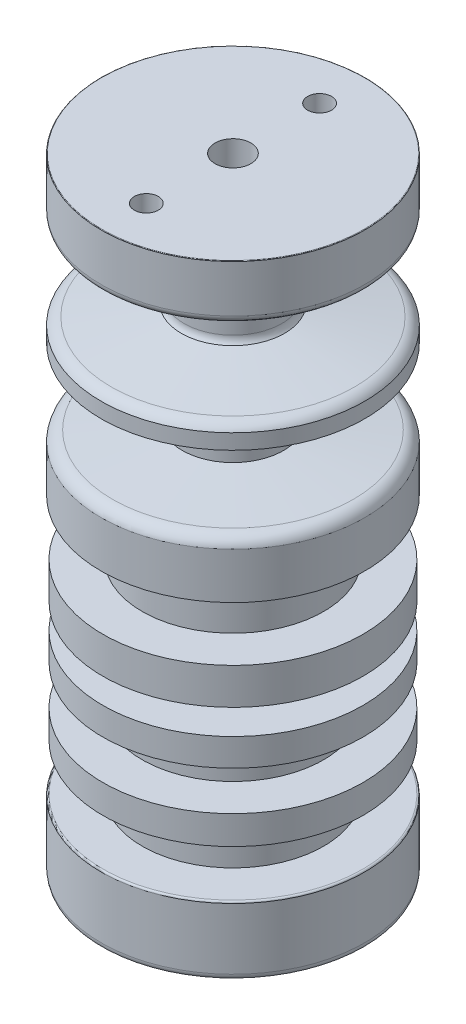
ISO-10303-21;
HEADER;
FILE_DESCRIPTION(('STEP AP214'),'2;1');
FILE_NAME('part.step','',(''),(''),'','','');
FILE_SCHEMA(('AUTOMOTIVE_DESIGN { 1 0 10303 214 1 1 1 1 }'));
ENDSEC;
DATA;
#1=APPLICATION_CONTEXT('core data for automotive mechanical design processes');
#2=APPLICATION_PROTOCOL_DEFINITION('international standard','automotive_design',2000,#1);
#3=PRODUCT_CONTEXT('',#1,'mechanical');
#4=PRODUCT('Part','Part','',(#3));
#5=PRODUCT_RELATED_PRODUCT_CATEGORY('part','',(#4));
#6=PRODUCT_DEFINITION_FORMATION('','',#4);
#7=PRODUCT_DEFINITION_CONTEXT('part definition',#1,'design');
#8=PRODUCT_DEFINITION('design','',#6,#7);
#9=PRODUCT_DEFINITION_SHAPE('','',#8);
#10=(LENGTH_UNIT() NAMED_UNIT(*) SI_UNIT(.MILLI.,.METRE.));
#11=(NAMED_UNIT(*) PLANE_ANGLE_UNIT() SI_UNIT($,.RADIAN.));
#12=(NAMED_UNIT(*) SI_UNIT($,.STERADIAN.) SOLID_ANGLE_UNIT());
#13=UNCERTAINTY_MEASURE_WITH_UNIT(LENGTH_MEASURE(1.E-05),#10,'distance_accuracy_value','');
#14=(GEOMETRIC_REPRESENTATION_CONTEXT(3) GLOBAL_UNCERTAINTY_ASSIGNED_CONTEXT((#13)) GLOBAL_UNIT_ASSIGNED_CONTEXT((#10,
#11,#12)) REPRESENTATION_CONTEXT('',''));
#15=CARTESIAN_POINT('',(0.,0.,0.));
#16=DIRECTION('',(0.,0.,1.));
#17=DIRECTION('',(1.,0.,0.));
#18=AXIS2_PLACEMENT_3D('',#15,#16,#17);
#19=CARTESIAN_POINT('',(0.,-121.955431754864,0.));
#20=DIRECTION('',(0.,-1.,0.));
#21=DIRECTION('',(1.,0.,0.));
#22=AXIS2_PLACEMENT_3D('',#19,#20,#21);
#23=CONICAL_SURFACE('',#22,0.,1.56977202903622);
#24=CARTESIAN_POINT('',(0.,-121.991013624139,0.));
#25=DIRECTION('',(0.,1.,0.));
#26=DIRECTION('',(-1.,0.,0.));
#27=AXIS2_PLACEMENT_3D('',#24,#25,#26);
#28=CIRCLE('',#27,34.7378060037741);
#29=CARTESIAN_POINT('',(34.7378060037709,-121.991013624139,0.));
#30=VERTEX_POINT('',#29);
#31=EDGE_CURVE('E135',#30,#30,#28,.T.);
#32=CARTESIAN_POINT('',(0.,-121.963562121167,0.));
#33=DIRECTION('',(0.,-1.,0.));
#34=DIRECTION('',(1.,0.,0.));
#35=AXIS2_PLACEMENT_3D('',#32,#33,#34);
#36=CIRCLE('',#35,7.9375);
#37=CARTESIAN_POINT('',(7.93749999999986,-121.963562121167,0.));
#38=VERTEX_POINT('',#37);
#39=EDGE_CURVE('E35',#38,#38,#36,.T.);
#40=CARTESIAN_POINT('',(34.7378060037709,-121.991013624139,0.));
#41=CARTESIAN_POINT('',(34.4586361495649,-121.990727670983,0.));
#42=CARTESIAN_POINT('',(34.179466295359,-121.990441717827,0.));
#43=CARTESIAN_POINT('',(33.6211265869471,-121.989869811515,0.));
#44=CARTESIAN_POINT('',(33.3419567327411,-121.989583858359,0.));
#45=CARTESIAN_POINT('',(32.7836170243292,-121.989011952047,0.));
#46=CARTESIAN_POINT('',(32.5044471701233,-121.988725998891,0.));
#47=CARTESIAN_POINT('',(31.9461074617114,-121.988154092579,0.));
#48=CARTESIAN_POINT('',(31.6669376075054,-121.987868139423,0.));
#49=CARTESIAN_POINT('',(31.1085978990935,-121.987296233111,0.));
#50=CARTESIAN_POINT('',(30.8294280448876,-121.987010279955,0.));
#51=CARTESIAN_POINT('',(30.2710883364757,-121.986438373643,0.));
#52=CARTESIAN_POINT('',(29.9919184822697,-121.986152420487,0.));
#53=CARTESIAN_POINT('',(29.4335787738579,-121.985580514175,0.));
#54=CARTESIAN_POINT('',(29.1544089196519,-121.985294561019,0.));
#55=CARTESIAN_POINT('',(28.59606921124,-121.984722654708,0.));
#56=CARTESIAN_POINT('',(28.3168993570341,-121.984436701552,0.));
#57=CARTESIAN_POINT('',(27.7585596486222,-121.98386479524,0.));
#58=CARTESIAN_POINT('',(27.4793897944162,-121.983578842084,0.));
#59=CARTESIAN_POINT('',(26.9210500860043,-121.983006935772,0.));
#60=CARTESIAN_POINT('',(26.6418802317984,-121.982720982616,0.));
#61=CARTESIAN_POINT('',(26.0835405233865,-121.982149076304,0.));
#62=CARTESIAN_POINT('',(25.8043706691805,-121.981863123148,0.));
#63=CARTESIAN_POINT('',(25.2460309607686,-121.981291216836,0.));
#64=CARTESIAN_POINT('',(24.9668611065627,-121.98100526368,0.));
#65=CARTESIAN_POINT('',(24.4085213981508,-121.980433357368,0.));
#66=CARTESIAN_POINT('',(24.1293515439448,-121.980147404212,0.));
#67=CARTESIAN_POINT('',(23.5710118355329,-121.9795754979,0.));
#68=CARTESIAN_POINT('',(23.291841981327,-121.979289544744,0.));
#69=CARTESIAN_POINT('',(22.7335022729151,-121.978717638432,0.));
#70=CARTESIAN_POINT('',(22.4543324187092,-121.978431685276,0.));
#71=CARTESIAN_POINT('',(21.8959927102973,-121.977859778965,0.));
#72=CARTESIAN_POINT('',(21.6168228560913,-121.977573825809,0.));
#73=CARTESIAN_POINT('',(21.0584831476794,-121.977001919497,0.));
#74=CARTESIAN_POINT('',(20.7793132934735,-121.976715966341,0.));
#75=CARTESIAN_POINT('',(20.2209735850616,-121.976144060029,0.));
#76=CARTESIAN_POINT('',(19.9418037308556,-121.975858106873,0.));
#77=CARTESIAN_POINT('',(19.3834640224437,-121.975286200561,0.));
#78=CARTESIAN_POINT('',(19.1042941682378,-121.975000247405,0.));
#79=CARTESIAN_POINT('',(18.5459544598259,-121.974428341093,0.));
#80=CARTESIAN_POINT('',(18.2667846056199,-121.974142387937,0.));
#81=CARTESIAN_POINT('',(17.708444897208,-121.973570481625,0.));
#82=CARTESIAN_POINT('',(17.4292750430021,-121.973284528469,0.));
#83=CARTESIAN_POINT('',(16.8709353345902,-121.972712622157,0.));
#84=CARTESIAN_POINT('',(16.5917654803842,-121.972426669001,0.));
#85=CARTESIAN_POINT('',(16.0334257719724,-121.971854762689,0.));
#86=CARTESIAN_POINT('',(15.7542559177664,-121.971568809533,0.));
#87=CARTESIAN_POINT('',(15.1959162093545,-121.970996903221,0.));
#88=CARTESIAN_POINT('',(14.9167463551486,-121.970710950066,0.));
#89=CARTESIAN_POINT('',(14.3584066467367,-121.970139043754,0.));
#90=CARTESIAN_POINT('',(14.0792367925307,-121.969853090598,0.));
#91=CARTESIAN_POINT('',(13.5208970841188,-121.969281184286,0.));
#92=CARTESIAN_POINT('',(13.2417272299129,-121.96899523113,0.));
#93=CARTESIAN_POINT('',(12.683387521501,-121.968423324818,0.));
#94=CARTESIAN_POINT('',(12.404217667295,-121.968137371662,0.));
#95=CARTESIAN_POINT('',(11.8458779588831,-121.96756546535,0.));
#96=CARTESIAN_POINT('',(11.5667081046772,-121.967279512194,0.));
#97=CARTESIAN_POINT('',(11.0083683962653,-121.966707605882,0.));
#98=CARTESIAN_POINT('',(10.7291985420593,-121.966421652726,0.));
#99=CARTESIAN_POINT('',(10.1708588336474,-121.965849746414,0.));
#100=CARTESIAN_POINT('',(9.8916889794415,-121.965563793258,0.));
#101=CARTESIAN_POINT('',(9.3333492710296,-121.964991886946,0.));
#102=CARTESIAN_POINT('',(9.05417941682365,-121.96470593379,0.));
#103=CARTESIAN_POINT('',(8.49583970841176,-121.964134027478,0.));
#104=CARTESIAN_POINT('',(8.21666985420581,-121.963848074323,0.));
#105=CARTESIAN_POINT('',(7.93749999999986,-121.963562121167,0.));
#106=B_SPLINE_CURVE_WITH_KNOTS('',3,(#40,#41,#42,#43,#44,#45,#46,#47,#48,#49,#50,#51,#52,#53,
#54,#55,#56,#57,#58,#59,#60,#61,#62,#63,#64,#65,#66,#67,#68,#69,#70,#71,#72,#73,#74,#75,#76,#77,
#78,#79,#80,#81,#82,#83,#84,#85,#86,#87,#88,#89,#90,#91,#92,#93,#94,#95,#96,#97,#98,#99,#100,
#101,#102,#103,#104,#105),.UNSPECIFIED.,.F.,.F.,(4,2,2,2,2,2,2,2,2,2,2,2,2,2,2,2,2,2,2,2,2,2,2,
2,2,2,2,2,2,2,2,2,4),(0.,0.837510001969652,1.6750200039393,2.51253000590894,3.35004000787859,
4.18755000984824,5.02506001181789,5.86257001378753,6.70008001575718,7.53759001772683,
8.37510001969648,9.21261002166612,10.0501200236358,10.8876300256054,11.7251400275751,
12.5626500295447,13.4001600315144,14.237670033484,15.0751800354537,15.9126900374233,
16.7502000393929,17.5877100413626,18.4252200433322,19.2627300453019,20.1002400472715,
20.9377500492412,21.7752600512108,22.6127700531805,23.4502800551501,24.2877900571198,
25.1253000590894,25.9628100610591,26.8003200630287),.UNSPECIFIED.);
#107=EDGE_CURVE('BSEAM31',#30,#38,#106,.T.);
#108=ORIENTED_EDGE('',*,*,#31,.F.);
#109=ORIENTED_EDGE('',*,*,#39,.F.);
#110=ORIENTED_EDGE('',*,*,#107,.T.);
#111=ORIENTED_EDGE('',*,*,#107,.F.);
#112=EDGE_LOOP('',(#108,#110,#109,#111));
#113=FACE_BOUND('',#112,.T.);
#114=ADVANCED_FACE('F31',(#113),#23,.F.);
#115=CARTESIAN_POINT('',(0.,43.0445682451364,0.));
#116=DIRECTION('',(0.,-1.,0.));
#117=DIRECTION('',(1.,0.,0.));
#118=AXIS2_PLACEMENT_3D('',#115,#116,#117);
#119=PLANE('',#118);
#120=CARTESIAN_POINT('',(0.,43.0445682451364,0.));
#121=DIRECTION('',(0.,1.,0.));
#122=DIRECTION('',(0.,0.,1.));
#123=AXIS2_PLACEMENT_3D('',#120,#121,#122);
#124=CIRCLE('',#123,4.7625);
#125=CARTESIAN_POINT('',(0.,43.0445682451364,4.7625));
#126=VERTEX_POINT('',#125);
#127=EDGE_CURVE('E151',#126,#126,#124,.T.);
#128=ORIENTED_EDGE('',*,*,#127,.F.);
#129=EDGE_LOOP('',(#128));
#130=FACE_BOUND('',#129,.T.);
#131=CARTESIAN_POINT('',(0.,43.0445682451364,23.));
#132=DIRECTION('',(0.,1.,0.));
#133=DIRECTION('',(0.,0.,1.));
#134=AXIS2_PLACEMENT_3D('',#131,#132,#133);
#135=CIRCLE('',#134,3.175);
#136=CARTESIAN_POINT('',(0.,43.0445682451364,26.175));
#137=VERTEX_POINT('',#136);
#138=EDGE_CURVE('E145',#137,#137,#135,.T.);
#139=ORIENTED_EDGE('',*,*,#138,.F.);
#140=EDGE_LOOP('',(#139));
#141=FACE_BOUND('',#140,.T.);
#142=CARTESIAN_POINT('',(0.,43.0445682451364,-23.));
#143=DIRECTION('',(0.,1.,0.));
#144=DIRECTION('',(0.,0.,1.));
#145=AXIS2_PLACEMENT_3D('',#142,#143,#144);
#146=CIRCLE('',#145,3.175);
#147=CARTESIAN_POINT('',(0.,43.0445682451364,-19.825));
#148=VERTEX_POINT('',#147);
#149=EDGE_CURVE('E139',#148,#148,#146,.T.);
#150=ORIENTED_EDGE('',*,*,#149,.F.);
#151=EDGE_LOOP('',(#150));
#152=FACE_BOUND('',#151,.T.);
#153=CARTESIAN_POINT('',(0.,43.0445682451364,0.));
#154=DIRECTION('',(0.,1.,0.));
#155=DIRECTION('',(-1.,0.,0.));
#156=AXIS2_PLACEMENT_3D('',#153,#154,#155);
#157=CIRCLE('',#156,34.8584196821975);
#158=CARTESIAN_POINT('',(-34.8584196821975,43.0445682451364,0.));
#159=VERTEX_POINT('',#158);
#160=EDGE_CURVE('E10',#159,#159,#157,.T.);
#161=ORIENTED_EDGE('',*,*,#160,.T.);
#162=EDGE_LOOP('',(#161));
#163=FACE_BOUND('',#162,.T.);
#164=ADVANCED_FACE('F33',(#130,#141,#152,#163),#119,.F.);
#165=CARTESIAN_POINT('',(0.,42.9029879273339,0.));
#166=DIRECTION('',(0.,1.,0.));
#167=DIRECTION('',(-1.,0.,0.));
#168=AXIS2_PLACEMENT_3D('',#165,#166,#167);
#169=TOROIDAL_SURFACE('',#168,34.8584196821975,0.141580317802481);
#170=ORIENTED_EDGE('',*,*,#160,.F.);
#171=EDGE_LOOP('',(#170));
#172=FACE_BOUND('',#171,.T.);
#173=CARTESIAN_POINT('',(0.,42.9029879273339,0.));
#174=DIRECTION('',(0.,1.,0.));
#175=DIRECTION('',(-1.,0.,0.));
#176=AXIS2_PLACEMENT_3D('',#173,#174,#175);
#177=CIRCLE('',#176,35.);
#178=CARTESIAN_POINT('',(-35.,42.9029879273339,0.));
#179=VERTEX_POINT('',#178);
#180=EDGE_CURVE('E39',#179,#179,#177,.T.);
#181=ORIENTED_EDGE('',*,*,#180,.T.);
#182=EDGE_LOOP('',(#181));
#183=FACE_BOUND('',#182,.T.);
#184=ADVANCED_FACE('F171',(#172,#183),#169,.T.);
#185=CARTESIAN_POINT('',(0.,43.0445682451364,0.));
#186=DIRECTION('',(0.,1.,0.));
#187=DIRECTION('',(-1.,0.,0.));
#188=AXIS2_PLACEMENT_3D('',#185,#186,#187);
#189=CYLINDRICAL_SURFACE('',#188,35.);
#190=ORIENTED_EDGE('',*,*,#180,.F.);
#191=EDGE_LOOP('',(#190));
#192=FACE_BOUND('',#191,.T.);
#193=CARTESIAN_POINT('',(0.,30.3660149299546,0.));
#194=DIRECTION('',(0.,1.,0.));
#195=DIRECTION('',(-1.,0.,0.));
#196=AXIS2_PLACEMENT_3D('',#193,#194,#195);
#197=CIRCLE('',#196,35.);
#198=CARTESIAN_POINT('',(-35.,30.3660149299546,0.));
#199=VERTEX_POINT('',#198);
#200=EDGE_CURVE('E43',#199,#199,#197,.T.);
#201=ORIENTED_EDGE('',*,*,#200,.T.);
#202=EDGE_LOOP('',(#201));
#203=FACE_BOUND('',#202,.T.);
#204=ADVANCED_FACE('F297',(#192,#203),#189,.T.);
#205=CARTESIAN_POINT('',(0.,30.3660149299546,0.));
#206=DIRECTION('',(0.,1.,0.));
#207=DIRECTION('',(-1.,0.,0.));
#208=AXIS2_PLACEMENT_3D('',#205,#206,#207);
#209=TOROIDAL_SURFACE('',#208,32.9643531045201,2.03564689547988);
#210=ORIENTED_EDGE('',*,*,#200,.F.);
#211=EDGE_LOOP('',(#210));
#212=FACE_BOUND('',#211,.T.);
#213=CARTESIAN_POINT('',(0.,28.3303680344748,0.));
#214=DIRECTION('',(0.,1.,0.));
#215=DIRECTION('',(-1.,0.,0.));
#216=AXIS2_PLACEMENT_3D('',#213,#214,#215);
#217=CIRCLE('',#216,32.9643531045201);
#218=CARTESIAN_POINT('',(-32.9643531045201,28.3303680344747,0.));
#219=VERTEX_POINT('',#218);
#220=EDGE_CURVE('E48',#219,#219,#217,.T.);
#221=ORIENTED_EDGE('',*,*,#220,.T.);
#222=EDGE_LOOP('',(#221));
#223=FACE_BOUND('',#222,.T.);
#224=ADVANCED_FACE('F293',(#212,#223),#209,.T.);
#225=CARTESIAN_POINT('',(32.9643531045201,28.3303680344748,0.));
#226=DIRECTION('',(0.,1.,0.));
#227=DIRECTION('',(-1.,0.,0.));
#228=AXIS2_PLACEMENT_3D('',#225,#226,#227);
#229=PLANE('',#228);
#230=ORIENTED_EDGE('',*,*,#220,.F.);
#231=EDGE_LOOP('',(#230));
#232=FACE_BOUND('',#231,.T.);
#233=CARTESIAN_POINT('',(0.,28.3303680344748,0.));
#234=DIRECTION('',(0.,1.,0.));
#235=DIRECTION('',(-1.,0.,0.));
#236=AXIS2_PLACEMENT_3D('',#233,#234,#235);
#237=CIRCLE('',#236,12.9857969124329);
#238=CARTESIAN_POINT('',(-12.9857969124329,28.3303680344748,0.));
#239=VERTEX_POINT('',#238);
#240=EDGE_CURVE('E51',#239,#239,#237,.T.);
#241=ORIENTED_EDGE('',*,*,#240,.T.);
#242=EDGE_LOOP('',(#241));
#243=FACE_BOUND('',#242,.T.);
#244=ADVANCED_FACE('F289',(#232,#243),#229,.F.);
#245=CARTESIAN_POINT('',(0.,43.0445682451364,0.));
#246=DIRECTION('',(0.,1.,0.));
#247=DIRECTION('',(-1.,0.,0.));
#248=AXIS2_PLACEMENT_3D('',#245,#246,#247);
#249=CYLINDRICAL_SURFACE('',#248,12.9857969124329);
#250=ORIENTED_EDGE('',*,*,#240,.F.);
#251=EDGE_LOOP('',(#250));
#252=FACE_BOUND('',#251,.T.);
#253=CARTESIAN_POINT('',(0.,10.4062076007876,0.));
#254=DIRECTION('',(0.,1.,0.));
#255=DIRECTION('',(-1.,0.,0.));
#256=AXIS2_PLACEMENT_3D('',#253,#254,#255);
#257=CIRCLE('',#256,12.9857969124329);
#258=CARTESIAN_POINT('',(-12.9857969124329,10.4062076007876,0.));
#259=VERTEX_POINT('',#258);
#260=EDGE_CURVE('E54',#259,#259,#257,.T.);
#261=ORIENTED_EDGE('',*,*,#260,.T.);
#262=EDGE_LOOP('',(#261));
#263=FACE_BOUND('',#262,.T.);
#264=ADVANCED_FACE('F285',(#252,#263),#249,.T.);
#265=CARTESIAN_POINT('',(0.,10.4062076007876,0.));
#266=DIRECTION('',(0.,1.,0.));
#267=DIRECTION('',(-1.,0.,0.));
#268=AXIS2_PLACEMENT_3D('',#265,#266,#267);
#269=TOROIDAL_SURFACE('',#268,15.8008154382432,2.81501852581031);
#270=ORIENTED_EDGE('',*,*,#260,.F.);
#271=EDGE_LOOP('',(#270));
#272=FACE_BOUND('',#271,.T.);
#273=CARTESIAN_POINT('',(0.,8.51251271153448,0.));
#274=DIRECTION('',(0.,1.,0.));
#275=DIRECTION('',(-1.,0.,0.));
#276=AXIS2_PLACEMENT_3D('',#273,#274,#275);
#277=CIRCLE('',#276,13.7179690763931);
#278=CARTESIAN_POINT('',(-13.7179690763931,8.51251271153447,0.));
#279=VERTEX_POINT('',#278);
#280=EDGE_CURVE('E57',#279,#279,#277,.T.);
#281=ORIENTED_EDGE('',*,*,#280,.T.);
#282=EDGE_LOOP('',(#281));
#283=FACE_BOUND('',#282,.T.);
#284=ADVANCED_FACE('F281',(#272,#283),#269,.F.);
#285=CARTESIAN_POINT('',(0.,5.48596194522862,0.));
#286=DIRECTION('',(0.,-1.,0.));
#287=DIRECTION('',(1.,0.,0.));
#288=AXIS2_PLACEMENT_3D('',#285,#286,#287);
#289=CONICAL_SURFACE('',#288,32.3097448153254,1.40942212691776);
#290=ORIENTED_EDGE('',*,*,#280,.F.);
#291=EDGE_LOOP('',(#290));
#292=FACE_BOUND('',#291,.T.);
#293=CARTESIAN_POINT('',(0.,5.48596194522862,0.));
#294=DIRECTION('',(0.,1.,0.));
#295=DIRECTION('',(-1.,0.,0.));
#296=AXIS2_PLACEMENT_3D('',#293,#294,#295);
#297=CIRCLE('',#296,32.3097448153254);
#298=CARTESIAN_POINT('',(-32.3097448153254,5.48596194522862,0.));
#299=VERTEX_POINT('',#298);
#300=EDGE_CURVE('E60',#299,#299,#297,.T.);
#301=ORIENTED_EDGE('',*,*,#300,.T.);
#302=EDGE_LOOP('',(#301));
#303=FACE_BOUND('',#302,.T.);
#304=ADVANCED_FACE('F277',(#292,#303),#289,.T.);
#305=CARTESIAN_POINT('',(0.,1.82897337850735,0.));
#306=DIRECTION('',(0.,1.,0.));
#307=DIRECTION('',(-1.,0.,0.));
#308=AXIS2_PLACEMENT_3D('',#305,#306,#307);
#309=TOROIDAL_SURFACE('',#308,31.714424513252,3.7051277493753);
#310=ORIENTED_EDGE('',*,*,#300,.F.);
#311=EDGE_LOOP('',(#310));
#312=FACE_BOUND('',#311,.T.);
#313=CARTESIAN_POINT('',(0.,3.54156362724511,0.));
#314=DIRECTION('',(0.,1.,0.));
#315=DIRECTION('',(-1.,0.,0.));
#316=AXIS2_PLACEMENT_3D('',#313,#314,#315);
#317=CIRCLE('',#316,35.);
#318=CARTESIAN_POINT('',(-35.,3.54156362724511,0.));
#319=VERTEX_POINT('',#318);
#320=EDGE_CURVE('E63',#319,#319,#317,.T.);
#321=ORIENTED_EDGE('',*,*,#320,.T.);
#322=EDGE_LOOP('',(#321));
#323=FACE_BOUND('',#322,.T.);
#324=ADVANCED_FACE('F273',(#312,#323),#309,.T.);
#325=CARTESIAN_POINT('',(0.,43.0445682451364,0.));
#326=DIRECTION('',(0.,1.,0.));
#327=DIRECTION('',(-1.,0.,0.));
#328=AXIS2_PLACEMENT_3D('',#325,#326,#327);
#329=CYLINDRICAL_SURFACE('',#328,35.);
#330=ORIENTED_EDGE('',*,*,#320,.F.);
#331=EDGE_LOOP('',(#330));
#332=FACE_BOUND('',#331,.T.);
#333=CARTESIAN_POINT('',(0.,-0.490098714239634,0.));
#334=DIRECTION('',(0.,1.,0.));
#335=DIRECTION('',(-1.,0.,0.));
#336=AXIS2_PLACEMENT_3D('',#333,#334,#335);
#337=CIRCLE('',#336,35.);
#338=CARTESIAN_POINT('',(-35.,-0.490098714239638,0.));
#339=VERTEX_POINT('',#338);
#340=EDGE_CURVE('E66',#339,#339,#337,.T.);
#341=ORIENTED_EDGE('',*,*,#340,.T.);
#342=EDGE_LOOP('',(#341));
#343=FACE_BOUND('',#342,.T.);
#344=ADVANCED_FACE('F269',(#332,#343),#329,.T.);
#345=CARTESIAN_POINT('',(13.4687354882585,-0.490098714239631,0.));
#346=DIRECTION('',(0.,1.,0.));
#347=DIRECTION('',(-1.,0.,0.));
#348=AXIS2_PLACEMENT_3D('',#345,#346,#347);
#349=PLANE('',#348);
#350=ORIENTED_EDGE('',*,*,#340,.F.);
#351=EDGE_LOOP('',(#350));
#352=FACE_BOUND('',#351,.T.);
#353=CARTESIAN_POINT('',(0.,-0.490098714239634,0.));
#354=DIRECTION('',(0.,1.,0.));
#355=DIRECTION('',(-1.,0.,0.));
#356=AXIS2_PLACEMENT_3D('',#353,#354,#355);
#357=CIRCLE('',#356,13.4687354882585);
#358=CARTESIAN_POINT('',(-13.4687354882585,-0.490098714239636,0.));
#359=VERTEX_POINT('',#358);
#360=EDGE_CURVE('E69',#359,#359,#357,.T.);
#361=ORIENTED_EDGE('',*,*,#360,.T.);
#362=EDGE_LOOP('',(#361));
#363=FACE_BOUND('',#362,.T.);
#364=ADVANCED_FACE('F265',(#352,#363),#349,.F.);
#365=CARTESIAN_POINT('',(0.,43.0445682451364,0.));
#366=DIRECTION('',(0.,1.,0.));
#367=DIRECTION('',(-1.,0.,0.));
#368=AXIS2_PLACEMENT_3D('',#365,#366,#367);
#369=CYLINDRICAL_SURFACE('',#368,13.4687354882585);
#370=ORIENTED_EDGE('',*,*,#360,.F.);
#371=EDGE_LOOP('',(#370));
#372=FACE_BOUND('',#371,.T.);
#373=CARTESIAN_POINT('',(0.,-18.538757945872,0.));
#374=DIRECTION('',(0.,1.,0.));
#375=DIRECTION('',(-1.,0.,0.));
#376=AXIS2_PLACEMENT_3D('',#373,#374,#375);
#377=CIRCLE('',#376,13.4687354882585);
#378=CARTESIAN_POINT('',(-13.4687354882585,-18.538757945872,0.));
#379=VERTEX_POINT('',#378);
#380=EDGE_CURVE('E72',#379,#379,#377,.T.);
#381=ORIENTED_EDGE('',*,*,#380,.T.);
#382=EDGE_LOOP('',(#381));
#383=FACE_BOUND('',#382,.T.);
#384=ADVANCED_FACE('F261',(#372,#383),#369,.T.);
#385=CARTESIAN_POINT('',(0.,-20.5131962872159,0.));
#386=DIRECTION('',(0.,-1.,0.));
#387=DIRECTION('',(1.,0.,0.));
#388=AXIS2_PLACEMENT_3D('',#385,#386,#387);
#389=CONICAL_SURFACE('',#388,31.9792266270137,1.46453221422253);
#390=ORIENTED_EDGE('',*,*,#380,.F.);
#391=EDGE_LOOP('',(#390));
#392=FACE_BOUND('',#391,.T.);
#393=CARTESIAN_POINT('',(0.,-20.5131962872159,0.));
#394=DIRECTION('',(0.,1.,0.));
#395=DIRECTION('',(-1.,0.,0.));
#396=AXIS2_PLACEMENT_3D('',#393,#394,#395);
#397=CIRCLE('',#396,31.9792266270137);
#398=CARTESIAN_POINT('',(-31.9792266270137,-20.5131962872159,0.));
#399=VERTEX_POINT('',#398);
#400=EDGE_CURVE('E75',#399,#399,#397,.T.);
#401=ORIENTED_EDGE('',*,*,#400,.T.);
#402=EDGE_LOOP('',(#401));
#403=FACE_BOUND('',#402,.T.);
#404=ADVANCED_FACE('F257',(#392,#403),#389,.T.);
#405=CARTESIAN_POINT('',(0.,-23.9615059492109,0.));
#406=DIRECTION('',(0.,1.,0.));
#407=DIRECTION('',(-1.,0.,0.));
#408=AXIS2_PLACEMENT_3D('',#405,#406,#407);
#409=TOROIDAL_SURFACE('',#408,31.6114095465033,3.46787095055789);
#410=ORIENTED_EDGE('',*,*,#400,.F.);
#411=EDGE_LOOP('',(#410));
#412=FACE_BOUND('',#411,.T.);
#413=CARTESIAN_POINT('',(0.,-23.2242246811764,0.));
#414=DIRECTION('',(0.,1.,0.));
#415=DIRECTION('',(-1.,0.,0.));
#416=AXIS2_PLACEMENT_3D('',#413,#414,#415);
#417=CIRCLE('',#416,35.);
#418=CARTESIAN_POINT('',(-35.,-23.2242246811764,0.));
#419=VERTEX_POINT('',#418);
#420=EDGE_CURVE('E78',#419,#419,#417,.T.);
#421=ORIENTED_EDGE('',*,*,#420,.T.);
#422=EDGE_LOOP('',(#421));
#423=FACE_BOUND('',#422,.T.);
#424=ADVANCED_FACE('F253',(#412,#423),#409,.T.);
#425=CARTESIAN_POINT('',(0.,43.0445682451364,0.));
#426=DIRECTION('',(0.,1.,0.));
#427=DIRECTION('',(-1.,0.,0.));
#428=AXIS2_PLACEMENT_3D('',#425,#426,#427);
#429=CYLINDRICAL_SURFACE('',#428,35.);
#430=ORIENTED_EDGE('',*,*,#420,.F.);
#431=EDGE_LOOP('',(#430));
#432=FACE_BOUND('',#431,.T.);
#433=CARTESIAN_POINT('',(0.,-35.501069654203,0.));
#434=DIRECTION('',(0.,1.,0.));
#435=DIRECTION('',(-1.,0.,0.));
#436=AXIS2_PLACEMENT_3D('',#433,#434,#435);
#437=CIRCLE('',#436,35.);
#438=CARTESIAN_POINT('',(-35.,-35.501069654203,0.));
#439=VERTEX_POINT('',#438);
#440=EDGE_CURVE('E81',#439,#439,#437,.T.);
#441=ORIENTED_EDGE('',*,*,#440,.T.);
#442=EDGE_LOOP('',(#441));
#443=FACE_BOUND('',#442,.T.);
#444=ADVANCED_FACE('F249',(#432,#443),#429,.T.);
#445=CARTESIAN_POINT('',(35.,-35.501069654203,0.));
#446=DIRECTION('',(0.,1.,0.));
#447=DIRECTION('',(-1.,0.,0.));
#448=AXIS2_PLACEMENT_3D('',#445,#446,#447);
#449=PLANE('',#448);
#450=ORIENTED_EDGE('',*,*,#440,.F.);
#451=EDGE_LOOP('',(#450));
#452=FACE_BOUND('',#451,.T.);
#453=CARTESIAN_POINT('',(0.,-35.501069654203,0.));
#454=DIRECTION('',(0.,1.,0.));
#455=DIRECTION('',(-1.,0.,0.));
#456=AXIS2_PLACEMENT_3D('',#453,#454,#455);
#457=CIRCLE('',#456,24.0860533652923);
#458=CARTESIAN_POINT('',(-24.0860533652923,-35.501069654203,0.));
#459=VERTEX_POINT('',#458);
#460=EDGE_CURVE('E84',#459,#459,#457,.T.);
#461=ORIENTED_EDGE('',*,*,#460,.T.);
#462=EDGE_LOOP('',(#461));
#463=FACE_BOUND('',#462,.T.);
#464=ADVANCED_FACE('F245',(#452,#463),#449,.F.);
#465=CARTESIAN_POINT('',(0.,43.0445682451364,0.));
#466=DIRECTION('',(0.,1.,0.));
#467=DIRECTION('',(-1.,0.,0.));
#468=AXIS2_PLACEMENT_3D('',#465,#466,#467);
#469=CYLINDRICAL_SURFACE('',#468,24.0860533652923);
#470=ORIENTED_EDGE('',*,*,#460,.F.);
#471=EDGE_LOOP('',(#470));
#472=FACE_BOUND('',#471,.T.);
#473=CARTESIAN_POINT('',(0.,-50.2632732960367,0.));
#474=DIRECTION('',(0.,1.,0.));
#475=DIRECTION('',(-1.,0.,0.));
#476=AXIS2_PLACEMENT_3D('',#473,#474,#475);
#477=CIRCLE('',#476,24.0860533652923);
#478=CARTESIAN_POINT('',(-24.0860533652923,-50.2632732960367,0.));
#479=VERTEX_POINT('',#478);
#480=EDGE_CURVE('E87',#479,#479,#477,.T.);
#481=ORIENTED_EDGE('',*,*,#480,.T.);
#482=EDGE_LOOP('',(#481));
#483=FACE_BOUND('',#482,.T.);
#484=ADVANCED_FACE('F241',(#472,#483),#469,.T.);
#485=CARTESIAN_POINT('',(34.5383420831025,-50.2632732960367,0.));
#486=DIRECTION('',(0.,-1.,0.));
#487=DIRECTION('',(1.,0.,0.));
#488=AXIS2_PLACEMENT_3D('',#485,#486,#487);
#489=PLANE('',#488);
#490=ORIENTED_EDGE('',*,*,#480,.F.);
#491=EDGE_LOOP('',(#490));
#492=FACE_BOUND('',#491,.T.);
#493=CARTESIAN_POINT('',(0.,-50.2632732960367,0.));
#494=DIRECTION('',(0.,1.,0.));
#495=DIRECTION('',(-1.,0.,0.));
#496=AXIS2_PLACEMENT_3D('',#493,#494,#495);
#497=CIRCLE('',#496,34.5383420831025);
#498=CARTESIAN_POINT('',(-34.5383420831025,-50.2632732960367,0.));
#499=VERTEX_POINT('',#498);
#500=EDGE_CURVE('E90',#499,#499,#497,.T.);
#501=ORIENTED_EDGE('',*,*,#500,.T.);
#502=EDGE_LOOP('',(#501));
#503=FACE_BOUND('',#502,.T.);
#504=ADVANCED_FACE('F237',(#492,#503),#489,.F.);
#505=CARTESIAN_POINT('',(0.,43.0445682451364,0.));
#506=DIRECTION('',(0.,1.,0.));
#507=DIRECTION('',(-1.,0.,0.));
#508=AXIS2_PLACEMENT_3D('',#505,#506,#507);
#509=CYLINDRICAL_SURFACE('',#508,34.5383420831025);
#510=ORIENTED_EDGE('',*,*,#500,.F.);
#511=EDGE_LOOP('',(#510));
#512=FACE_BOUND('',#511,.T.);
#513=CARTESIAN_POINT('',(0.,-59.9179333119601,0.));
#514=DIRECTION('',(0.,1.,0.));
#515=DIRECTION('',(-1.,0.,0.));
#516=AXIS2_PLACEMENT_3D('',#513,#514,#515);
#517=CIRCLE('',#516,34.5383420831025);
#518=CARTESIAN_POINT('',(-34.5383420831025,-59.9179333119601,0.));
#519=VERTEX_POINT('',#518);
#520=EDGE_CURVE('E93',#519,#519,#517,.T.);
#521=ORIENTED_EDGE('',*,*,#520,.T.);
#522=EDGE_LOOP('',(#521));
#523=FACE_BOUND('',#522,.T.);
#524=ADVANCED_FACE('F233',(#512,#523),#509,.T.);
#525=CARTESIAN_POINT('',(24.0860533652924,-59.9179333119601,0.));
#526=DIRECTION('',(0.,1.,0.));
#527=DIRECTION('',(-1.,0.,0.));
#528=AXIS2_PLACEMENT_3D('',#525,#526,#527);
#529=PLANE('',#528);
#530=ORIENTED_EDGE('',*,*,#520,.F.);
#531=EDGE_LOOP('',(#530));
#532=FACE_BOUND('',#531,.T.);
#533=CARTESIAN_POINT('',(0.,-59.9179333119601,0.));
#534=DIRECTION('',(0.,1.,0.));
#535=DIRECTION('',(-1.,0.,0.));
#536=AXIS2_PLACEMENT_3D('',#533,#534,#535);
#537=CIRCLE('',#536,24.0860533652923);
#538=CARTESIAN_POINT('',(-24.0860533652923,-59.9179333119601,0.));
#539=VERTEX_POINT('',#538);
#540=EDGE_CURVE('E96',#539,#539,#537,.T.);
#541=ORIENTED_EDGE('',*,*,#540,.T.);
#542=EDGE_LOOP('',(#541));
#543=FACE_BOUND('',#542,.T.);
#544=ADVANCED_FACE('F229',(#532,#543),#529,.F.);
#545=CARTESIAN_POINT('',(0.,43.0445682451364,0.));
#546=DIRECTION('',(0.,1.,0.));
#547=DIRECTION('',(-1.,0.,0.));
#548=AXIS2_PLACEMENT_3D('',#545,#546,#547);
#549=CYLINDRICAL_SURFACE('',#548,24.0860533652923);
#550=ORIENTED_EDGE('',*,*,#540,.F.);
#551=EDGE_LOOP('',(#550));
#552=FACE_BOUND('',#551,.T.);
#553=CARTESIAN_POINT('',(0.,-66.6170851597436,0.));
#554=DIRECTION('',(0.,1.,0.));
#555=DIRECTION('',(-1.,0.,0.));
#556=AXIS2_PLACEMENT_3D('',#553,#554,#555);
#557=CIRCLE('',#556,24.0860533652923);
#558=CARTESIAN_POINT('',(-24.0860533652923,-66.6170851597436,0.));
#559=VERTEX_POINT('',#558);
#560=EDGE_CURVE('E99',#559,#559,#557,.T.);
#561=ORIENTED_EDGE('',*,*,#560,.T.);
#562=EDGE_LOOP('',(#561));
#563=FACE_BOUND('',#562,.T.);
#564=ADVANCED_FACE('F225',(#552,#563),#549,.T.);
#565=CARTESIAN_POINT('',(34.5383420831025,-66.6170851597436,0.));
#566=DIRECTION('',(0.,-1.,0.));
#567=DIRECTION('',(1.,0.,0.));
#568=AXIS2_PLACEMENT_3D('',#565,#566,#567);
#569=PLANE('',#568);
#570=ORIENTED_EDGE('',*,*,#560,.F.);
#571=EDGE_LOOP('',(#570));
#572=FACE_BOUND('',#571,.T.);
#573=CARTESIAN_POINT('',(0.,-66.6170851597436,0.));
#574=DIRECTION('',(0.,1.,0.));
#575=DIRECTION('',(-1.,0.,0.));
#576=AXIS2_PLACEMENT_3D('',#573,#574,#575);
#577=CIRCLE('',#576,34.5383420831025);
#578=CARTESIAN_POINT('',(-34.5383420831025,-66.6170851597436,0.));
#579=VERTEX_POINT('',#578);
#580=EDGE_CURVE('E102',#579,#579,#577,.T.);
#581=ORIENTED_EDGE('',*,*,#580,.T.);
#582=EDGE_LOOP('',(#581));
#583=FACE_BOUND('',#582,.T.);
#584=ADVANCED_FACE('F221',(#572,#583),#569,.F.);
#585=CARTESIAN_POINT('',(0.,43.0445682451364,0.));
#586=DIRECTION('',(0.,1.,0.));
#587=DIRECTION('',(-1.,0.,0.));
#588=AXIS2_PLACEMENT_3D('',#585,#586,#587);
#589=CYLINDRICAL_SURFACE('',#588,34.5383420831025);
#590=ORIENTED_EDGE('',*,*,#580,.F.);
#591=EDGE_LOOP('',(#590));
#592=FACE_BOUND('',#591,.T.);
#593=CARTESIAN_POINT('',(0.,-73.9073386411552,0.));
#594=DIRECTION('',(0.,1.,0.));
#595=DIRECTION('',(-1.,0.,0.));
#596=AXIS2_PLACEMENT_3D('',#593,#594,#595);
#597=CIRCLE('',#596,34.5383420831025);
#598=CARTESIAN_POINT('',(-34.5383420831025,-73.9073386411552,0.));
#599=VERTEX_POINT('',#598);
#600=EDGE_CURVE('E105',#599,#599,#597,.T.);
#601=ORIENTED_EDGE('',*,*,#600,.T.);
#602=EDGE_LOOP('',(#601));
#603=FACE_BOUND('',#602,.T.);
#604=ADVANCED_FACE('F217',(#592,#603),#589,.T.);
#605=CARTESIAN_POINT('',(24.0860533652924,-73.9073386411552,0.));
#606=DIRECTION('',(0.,1.,0.));
#607=DIRECTION('',(-1.,0.,0.));
#608=AXIS2_PLACEMENT_3D('',#605,#606,#607);
#609=PLANE('',#608);
#610=ORIENTED_EDGE('',*,*,#600,.F.);
#611=EDGE_LOOP('',(#610));
#612=FACE_BOUND('',#611,.T.);
#613=CARTESIAN_POINT('',(0.,-73.9073386411552,0.));
#614=DIRECTION('',(0.,1.,0.));
#615=DIRECTION('',(-1.,0.,0.));
#616=AXIS2_PLACEMENT_3D('',#613,#614,#615);
#617=CIRCLE('',#616,24.0860533652923);
#618=CARTESIAN_POINT('',(-24.0860533652923,-73.9073386411552,0.));
#619=VERTEX_POINT('',#618);
#620=EDGE_CURVE('E108',#619,#619,#617,.T.);
#621=ORIENTED_EDGE('',*,*,#620,.T.);
#622=EDGE_LOOP('',(#621));
#623=FACE_BOUND('',#622,.T.);
#624=ADVANCED_FACE('F213',(#612,#623),#609,.F.);
#625=CARTESIAN_POINT('',(0.,43.0445682451364,0.));
#626=DIRECTION('',(0.,1.,0.));
#627=DIRECTION('',(-1.,0.,0.));
#628=AXIS2_PLACEMENT_3D('',#625,#626,#627);
#629=CYLINDRICAL_SURFACE('',#628,24.0860533652923);
#630=ORIENTED_EDGE('',*,*,#620,.F.);
#631=EDGE_LOOP('',(#630));
#632=FACE_BOUND('',#631,.T.);
#633=CARTESIAN_POINT('',(0.,-84.3501341685825,0.));
#634=DIRECTION('',(0.,1.,0.));
#635=DIRECTION('',(-1.,0.,0.));
#636=AXIS2_PLACEMENT_3D('',#633,#634,#635);
#637=CIRCLE('',#636,24.0860533652923);
#638=CARTESIAN_POINT('',(-24.0860533652923,-84.3501341685825,0.));
#639=VERTEX_POINT('',#638);
#640=EDGE_CURVE('E111',#639,#639,#637,.T.);
#641=ORIENTED_EDGE('',*,*,#640,.T.);
#642=EDGE_LOOP('',(#641));
#643=FACE_BOUND('',#642,.T.);
#644=ADVANCED_FACE('F209',(#632,#643),#629,.T.);
#645=CARTESIAN_POINT('',(34.5383420831025,-84.3501341685825,0.));
#646=DIRECTION('',(0.,-1.,0.));
#647=DIRECTION('',(1.,0.,0.));
#648=AXIS2_PLACEMENT_3D('',#645,#646,#647);
#649=PLANE('',#648);
#650=ORIENTED_EDGE('',*,*,#640,.F.);
#651=EDGE_LOOP('',(#650));
#652=FACE_BOUND('',#651,.T.);
#653=CARTESIAN_POINT('',(0.,-84.3501341685825,0.));
#654=DIRECTION('',(0.,1.,0.));
#655=DIRECTION('',(-1.,0.,0.));
#656=AXIS2_PLACEMENT_3D('',#653,#654,#655);
#657=CIRCLE('',#656,34.5383420831025);
#658=CARTESIAN_POINT('',(-34.5383420831025,-84.3501341685825,0.));
#659=VERTEX_POINT('',#658);
#660=EDGE_CURVE('E114',#659,#659,#657,.T.);
#661=ORIENTED_EDGE('',*,*,#660,.T.);
#662=EDGE_LOOP('',(#661));
#663=FACE_BOUND('',#662,.T.);
#664=ADVANCED_FACE('F205',(#652,#663),#649,.F.);
#665=CARTESIAN_POINT('',(0.,43.0445682451364,0.));
#666=DIRECTION('',(0.,1.,0.));
#667=DIRECTION('',(-1.,0.,0.));
#668=AXIS2_PLACEMENT_3D('',#665,#666,#667);
#669=CYLINDRICAL_SURFACE('',#668,34.5383420831025);
#670=ORIENTED_EDGE('',*,*,#660,.F.);
#671=EDGE_LOOP('',(#670));
#672=FACE_BOUND('',#671,.T.);
#673=CARTESIAN_POINT('',(0.,-91.9233816601069,0.));
#674=DIRECTION('',(0.,1.,0.));
#675=DIRECTION('',(-1.,0.,0.));
#676=AXIS2_PLACEMENT_3D('',#673,#674,#675);
#677=CIRCLE('',#676,34.5383420831025);
#678=CARTESIAN_POINT('',(-34.5383420831025,-91.9233816601069,0.));
#679=VERTEX_POINT('',#678);
#680=EDGE_CURVE('E117',#679,#679,#677,.T.);
#681=ORIENTED_EDGE('',*,*,#680,.T.);
#682=EDGE_LOOP('',(#681));
#683=FACE_BOUND('',#682,.T.);
#684=ADVANCED_FACE('F201',(#672,#683),#669,.T.);
#685=CARTESIAN_POINT('',(24.0860533652924,-91.9233816601069,0.));
#686=DIRECTION('',(0.,1.,0.));
#687=DIRECTION('',(-1.,0.,0.));
#688=AXIS2_PLACEMENT_3D('',#685,#686,#687);
#689=PLANE('',#688);
#690=ORIENTED_EDGE('',*,*,#680,.F.);
#691=EDGE_LOOP('',(#690));
#692=FACE_BOUND('',#691,.T.);
#693=CARTESIAN_POINT('',(0.,-91.9233816601069,0.));
#694=DIRECTION('',(0.,1.,0.));
#695=DIRECTION('',(-1.,0.,0.));
#696=AXIS2_PLACEMENT_3D('',#693,#694,#695);
#697=CIRCLE('',#696,24.0860533652923);
#698=CARTESIAN_POINT('',(-24.0860533652923,-91.9233816601069,0.));
#699=VERTEX_POINT('',#698);
#700=EDGE_CURVE('E120',#699,#699,#697,.T.);
#701=ORIENTED_EDGE('',*,*,#700,.T.);
#702=EDGE_LOOP('',(#701));
#703=FACE_BOUND('',#702,.T.);
#704=ADVANCED_FACE('F197',(#692,#703),#689,.F.);
#705=CARTESIAN_POINT('',(0.,43.0445682451364,0.));
#706=DIRECTION('',(0.,1.,0.));
#707=DIRECTION('',(-1.,0.,0.));
#708=AXIS2_PLACEMENT_3D('',#705,#706,#707);
#709=CYLINDRICAL_SURFACE('',#708,24.0860533652923);
#710=ORIENTED_EDGE('',*,*,#700,.F.);
#711=EDGE_LOOP('',(#710));
#712=FACE_BOUND('',#711,.T.);
#713=CARTESIAN_POINT('',(0.,-104.221668073603,0.));
#714=DIRECTION('',(0.,1.,0.));
#715=DIRECTION('',(-1.,0.,0.));
#716=AXIS2_PLACEMENT_3D('',#713,#714,#715);
#717=CIRCLE('',#716,24.0860533652923);
#718=CARTESIAN_POINT('',(-24.0860533652923,-104.221668073603,0.));
#719=VERTEX_POINT('',#718);
#720=EDGE_CURVE('E123',#719,#719,#717,.T.);
#721=ORIENTED_EDGE('',*,*,#720,.T.);
#722=EDGE_LOOP('',(#721));
#723=FACE_BOUND('',#722,.T.);
#724=ADVANCED_FACE('F193',(#712,#723),#709,.T.);
#725=CARTESIAN_POINT('',(24.0860533652924,-104.221668073603,0.));
#726=DIRECTION('',(0.,-1.,0.));
#727=DIRECTION('',(1.,0.,0.));
#728=AXIS2_PLACEMENT_3D('',#725,#726,#727);
#729=PLANE('',#728);
#730=ORIENTED_EDGE('',*,*,#720,.F.);
#731=EDGE_LOOP('',(#730));
#732=FACE_BOUND('',#731,.T.);
#733=CARTESIAN_POINT('',(0.,-104.221668073603,0.));
#734=DIRECTION('',(0.,1.,0.));
#735=DIRECTION('',(-1.,0.,0.));
#736=AXIS2_PLACEMENT_3D('',#733,#734,#735);
#737=CIRCLE('',#736,34.5383420831025);
#738=CARTESIAN_POINT('',(-34.5383420831024,-104.221668073603,0.));
#739=VERTEX_POINT('',#738);
#740=EDGE_CURVE('E126',#739,#739,#737,.T.);
#741=ORIENTED_EDGE('',*,*,#740,.T.);
#742=EDGE_LOOP('',(#741));
#743=FACE_BOUND('',#742,.T.);
#744=ADVANCED_FACE('F189',(#732,#743),#729,.F.);
#745=CARTESIAN_POINT('',(0.,-104.683325990501,0.));
#746=DIRECTION('',(0.,1.,0.));
#747=DIRECTION('',(-1.,0.,0.));
#748=AXIS2_PLACEMENT_3D('',#745,#746,#747);
#749=TOROIDAL_SURFACE('',#748,34.5383420831025,0.461657916897524);
#750=ORIENTED_EDGE('',*,*,#740,.F.);
#751=EDGE_LOOP('',(#750));
#752=FACE_BOUND('',#751,.T.);
#753=CARTESIAN_POINT('',(0.,-104.683325990501,0.));
#754=DIRECTION('',(0.,1.,0.));
#755=DIRECTION('',(-1.,0.,0.));
#756=AXIS2_PLACEMENT_3D('',#753,#754,#755);
#757=CIRCLE('',#756,35.);
#758=CARTESIAN_POINT('',(-35.,-104.683325990501,0.));
#759=VERTEX_POINT('',#758);
#760=EDGE_CURVE('E129',#759,#759,#757,.T.);
#761=ORIENTED_EDGE('',*,*,#760,.T.);
#762=EDGE_LOOP('',(#761));
#763=FACE_BOUND('',#762,.T.);
#764=ADVANCED_FACE('F185',(#752,#763),#749,.T.);
#765=CARTESIAN_POINT('',(0.,43.0445682451364,0.));
#766=DIRECTION('',(0.,1.,0.));
#767=DIRECTION('',(-1.,0.,0.));
#768=AXIS2_PLACEMENT_3D('',#765,#766,#767);
#769=CYLINDRICAL_SURFACE('',#768,35.);
#770=ORIENTED_EDGE('',*,*,#760,.F.);
#771=EDGE_LOOP('',(#770));
#772=FACE_BOUND('',#771,.T.);
#773=CARTESIAN_POINT('',(0.,-120.950877142593,0.));
#774=DIRECTION('',(0.,1.,0.));
#775=DIRECTION('',(-1.,0.,0.));
#776=AXIS2_PLACEMENT_3D('',#773,#774,#775);
#777=CIRCLE('',#776,35.);
#778=CARTESIAN_POINT('',(-35.,-120.950877142593,0.));
#779=VERTEX_POINT('',#778);
#780=EDGE_CURVE('E132',#779,#779,#777,.T.);
#781=ORIENTED_EDGE('',*,*,#780,.T.);
#782=EDGE_LOOP('',(#781));
#783=FACE_BOUND('',#782,.T.);
#784=ADVANCED_FACE('F181',(#772,#783),#769,.T.);
#785=CARTESIAN_POINT('',(0.,-120.950877142593,0.));
#786=DIRECTION('',(0.,1.,0.));
#787=DIRECTION('',(-1.,0.,0.));
#788=AXIS2_PLACEMENT_3D('',#785,#786,#787);
#789=TOROIDAL_SURFACE('',#788,32.8057667062163,2.19423329378374);
#790=ORIENTED_EDGE('',*,*,#780,.F.);
#791=EDGE_LOOP('',(#790));
#792=FACE_BOUND('',#791,.T.);
#793=ORIENTED_EDGE('',*,*,#31,.T.);
#794=EDGE_LOOP('',(#793));
#795=FACE_BOUND('',#794,.T.);
#796=ADVANCED_FACE('F178',(#792,#795),#789,.T.);
#797=CARTESIAN_POINT('',(0.,31.0445682451364,-23.));
#798=DIRECTION('',(0.,1.,0.));
#799=DIRECTION('',(0.,0.,1.));
#800=AXIS2_PLACEMENT_3D('',#797,#798,#799);
#801=CYLINDRICAL_SURFACE('',#800,3.175);
#802=CARTESIAN_POINT('',(0.,31.0445682451364,-23.));
#803=DIRECTION('',(0.,1.,0.));
#804=DIRECTION('',(0.,0.,1.));
#805=AXIS2_PLACEMENT_3D('',#802,#803,#804);
#806=CIRCLE('',#805,3.175);
#807=CARTESIAN_POINT('',(0.,31.0445682451364,-19.825));
#808=VERTEX_POINT('',#807);
#809=EDGE_CURVE('E138',#808,#808,#806,.T.);
#810=ORIENTED_EDGE('',*,*,#809,.F.);
#811=EDGE_LOOP('',(#810));
#812=FACE_BOUND('',#811,.T.);
#813=ORIENTED_EDGE('',*,*,#149,.T.);
#814=EDGE_LOOP('',(#813));
#815=FACE_BOUND('',#814,.T.);
#816=ADVANCED_FACE('F176',(#812,#815),#801,.F.);
#817=CARTESIAN_POINT('',(0.,31.0445682451364,-23.));
#818=DIRECTION('',(0.,1.,0.));
#819=DIRECTION('',(0.,0.,1.));
#820=AXIS2_PLACEMENT_3D('',#817,#818,#819);
#821=PLANE('',#820);
#822=ORIENTED_EDGE('',*,*,#809,.T.);
#823=EDGE_LOOP('',(#822));
#824=FACE_BOUND('',#823,.T.);
#825=ADVANCED_FACE('F500',(#824),#821,.T.);
#826=CARTESIAN_POINT('',(0.,31.0445682451364,23.));
#827=DIRECTION('',(0.,1.,0.));
#828=DIRECTION('',(0.,0.,1.));
#829=AXIS2_PLACEMENT_3D('',#826,#827,#828);
#830=CYLINDRICAL_SURFACE('',#829,3.175);
#831=CARTESIAN_POINT('',(0.,31.0445682451364,23.));
#832=DIRECTION('',(0.,1.,0.));
#833=DIRECTION('',(0.,0.,1.));
#834=AXIS2_PLACEMENT_3D('',#831,#832,#833);
#835=CIRCLE('',#834,3.175);
#836=CARTESIAN_POINT('',(0.,31.0445682451364,26.175));
#837=VERTEX_POINT('',#836);
#838=EDGE_CURVE('E142',#837,#837,#835,.T.);
#839=ORIENTED_EDGE('',*,*,#838,.F.);
#840=EDGE_LOOP('',(#839));
#841=FACE_BOUND('',#840,.T.);
#842=ORIENTED_EDGE('',*,*,#138,.T.);
#843=EDGE_LOOP('',(#842));
#844=FACE_BOUND('',#843,.T.);
#845=ADVANCED_FACE('F507',(#841,#844),#830,.F.);
#846=CARTESIAN_POINT('',(0.,31.0445682451364,23.));
#847=DIRECTION('',(0.,1.,0.));
#848=DIRECTION('',(0.,0.,1.));
#849=AXIS2_PLACEMENT_3D('',#846,#847,#848);
#850=PLANE('',#849);
#851=ORIENTED_EDGE('',*,*,#838,.T.);
#852=EDGE_LOOP('',(#851));
#853=FACE_BOUND('',#852,.T.);
#854=ADVANCED_FACE('F514',(#853),#850,.T.);
#855=CARTESIAN_POINT('',(0.,31.0445682451364,0.));
#856=DIRECTION('',(0.,1.,0.));
#857=DIRECTION('',(0.,0.,1.));
#858=AXIS2_PLACEMENT_3D('',#855,#856,#857);
#859=CYLINDRICAL_SURFACE('',#858,4.7625);
#860=CARTESIAN_POINT('',(0.,31.0445682451364,0.));
#861=DIRECTION('',(0.,1.,0.));
#862=DIRECTION('',(0.,0.,1.));
#863=AXIS2_PLACEMENT_3D('',#860,#861,#862);
#864=CIRCLE('',#863,4.7625);
#865=CARTESIAN_POINT('',(0.,31.0445682451364,4.7625));
#866=VERTEX_POINT('',#865);
#867=EDGE_CURVE('E148',#866,#866,#864,.T.);
#868=ORIENTED_EDGE('',*,*,#867,.F.);
#869=EDGE_LOOP('',(#868));
#870=FACE_BOUND('',#869,.T.);
#871=ORIENTED_EDGE('',*,*,#127,.T.);
#872=EDGE_LOOP('',(#871));
#873=FACE_BOUND('',#872,.T.);
#874=ADVANCED_FACE('F522',(#870,#873),#859,.F.);
#875=CARTESIAN_POINT('',(0.,31.0445682451364,0.));
#876=DIRECTION('',(0.,1.,0.));
#877=DIRECTION('',(0.,0.,1.));
#878=AXIS2_PLACEMENT_3D('',#875,#876,#877);
#879=PLANE('',#878);
#880=ORIENTED_EDGE('',*,*,#867,.T.);
#881=EDGE_LOOP('',(#880));
#882=FACE_BOUND('',#881,.T.);
#883=ADVANCED_FACE('F530',(#882),#879,.T.);
#884=CARTESIAN_POINT('',(0.,-111.080431754864,0.));
#885=DIRECTION('',(0.,-1.,0.));
#886=DIRECTION('',(1.,0.,0.));
#887=AXIS2_PLACEMENT_3D('',#884,#885,#886);
#888=CYLINDRICAL_SURFACE('',#887,7.9375);
#889=CARTESIAN_POINT('',(0.,-111.080431754864,0.));
#890=DIRECTION('',(0.,1.,0.));
#891=DIRECTION('',(-1.,0.,0.));
#892=AXIS2_PLACEMENT_3D('',#889,#890,#891);
#893=CIRCLE('',#892,7.9375);
#894=CARTESIAN_POINT('',(-7.93749999999999,-111.080431754864,0.));
#895=VERTEX_POINT('',#894);
#896=EDGE_CURVE('E156',#895,#895,#893,.T.);
#897=ORIENTED_EDGE('',*,*,#896,.T.);
#898=EDGE_LOOP('',(#897));
#899=FACE_BOUND('',#898,.T.);
#900=ORIENTED_EDGE('',*,*,#39,.T.);
#901=EDGE_LOOP('',(#900));
#902=FACE_BOUND('',#901,.T.);
#903=ADVANCED_FACE('F163',(#899,#902),#888,.F.);
#904=CARTESIAN_POINT('',(0.,-111.080431754864,0.));
#905=DIRECTION('',(0.,1.,0.));
#906=DIRECTION('',(-1.,0.,0.));
#907=AXIS2_PLACEMENT_3D('',#904,#905,#906);
#908=PLANE('',#907);
#909=ORIENTED_EDGE('',*,*,#896,.F.);
#910=EDGE_LOOP('',(#909));
#911=FACE_BOUND('',#910,.T.);
#912=ADVANCED_FACE('F545',(#911),#908,.F.);
#913=CLOSED_SHELL('',(#114,#164,#184,#204,#224,#244,#264,#284,#304,#324,#344,#364,#384,#404,
#424,#444,#464,#484,#504,#524,#544,#564,#584,#604,#624,#644,#664,#684,#704,#724,#744,#764,#784,
#796,#816,#825,#845,#854,#874,#883,#903,#912));
#914=MANIFOLD_SOLID_BREP('B2',#913);
#915=ADVANCED_BREP_SHAPE_REPRESENTATION('',(#18,#914),#14);
#916=SHAPE_DEFINITION_REPRESENTATION(#9,#915);
ENDSEC;
END-ISO-10303-21;
